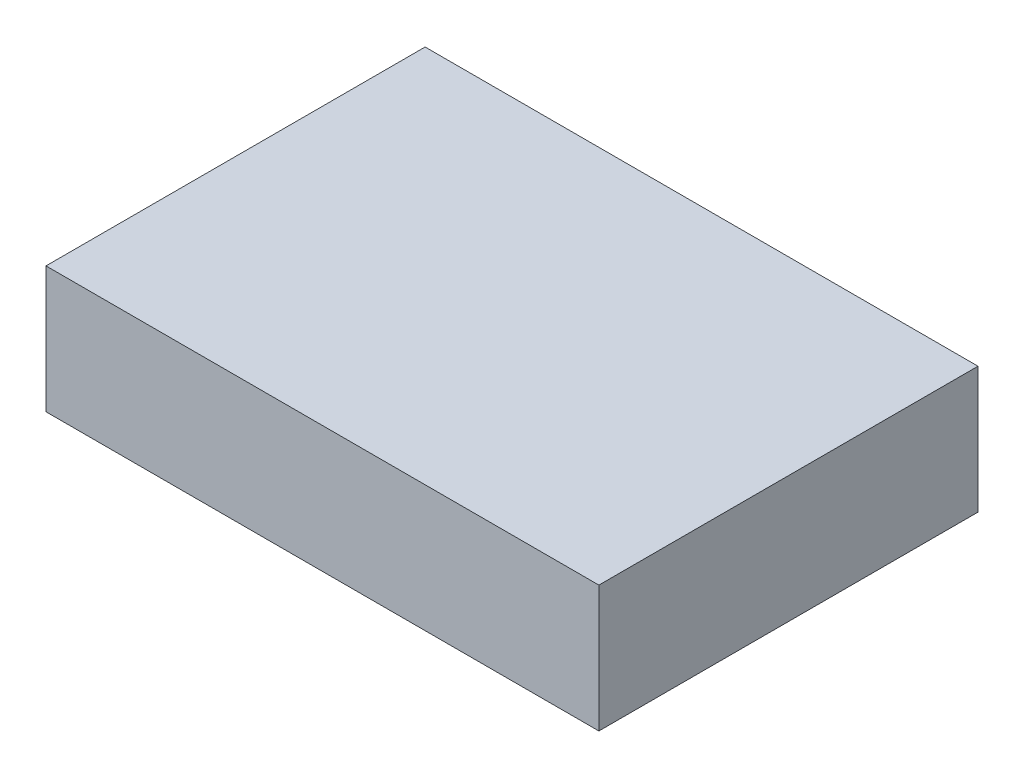
ISO-10303-21;
HEADER;
FILE_DESCRIPTION(('STEP AP214'),'2;1');
FILE_NAME('part.step','',(''),(''),'','','');
FILE_SCHEMA(('AUTOMOTIVE_DESIGN { 1 0 10303 214 1 1 1 1 }'));
ENDSEC;
DATA;
#1=APPLICATION_CONTEXT('core data for automotive mechanical design processes');
#2=APPLICATION_PROTOCOL_DEFINITION('international standard','automotive_design',2000,#1);
#3=PRODUCT_CONTEXT('',#1,'mechanical');
#4=PRODUCT('Part','Part','',(#3));
#5=PRODUCT_RELATED_PRODUCT_CATEGORY('part','',(#4));
#6=PRODUCT_DEFINITION_FORMATION('','',#4);
#7=PRODUCT_DEFINITION_CONTEXT('part definition',#1,'design');
#8=PRODUCT_DEFINITION('design','',#6,#7);
#9=PRODUCT_DEFINITION_SHAPE('','',#8);
#10=(LENGTH_UNIT() NAMED_UNIT(*) SI_UNIT(.MILLI.,.METRE.));
#11=(NAMED_UNIT(*) PLANE_ANGLE_UNIT() SI_UNIT($,.RADIAN.));
#12=(NAMED_UNIT(*) SI_UNIT($,.STERADIAN.) SOLID_ANGLE_UNIT());
#13=UNCERTAINTY_MEASURE_WITH_UNIT(LENGTH_MEASURE(1.E-05),#10,'distance_accuracy_value','');
#14=(GEOMETRIC_REPRESENTATION_CONTEXT(3) GLOBAL_UNCERTAINTY_ASSIGNED_CONTEXT((#13)) GLOBAL_UNIT_ASSIGNED_CONTEXT((#10,
#11,#12)) REPRESENTATION_CONTEXT('',''));
#15=CARTESIAN_POINT('',(0.,0.,0.));
#16=DIRECTION('',(0.,0.,1.));
#17=DIRECTION('',(1.,0.,0.));
#18=AXIS2_PLACEMENT_3D('',#15,#16,#17);
#19=CARTESIAN_POINT('',(17.5,8.,12.));
#20=DIRECTION('',(-1.,0.,0.));
#21=DIRECTION('',(0.,0.,1.));
#22=AXIS2_PLACEMENT_3D('',#19,#20,#21);
#23=PLANE('',#22);
#24=DIRECTION('',(0.,0.,-1.));
#25=VECTOR('',#24,1.);
#26=CARTESIAN_POINT('',(17.5,0.,12.));
#27=LINE('',#26,#25);
#28=CARTESIAN_POINT('',(17.5,0.,12.));
#29=VERTEX_POINT('',#28);
#30=CARTESIAN_POINT('',(17.5,0.,-12.));
#31=VERTEX_POINT('',#30);
#32=EDGE_CURVE('E98',#29,#31,#27,.T.);
#33=ORIENTED_EDGE('',*,*,#32,.T.);
#34=DIRECTION('',(0.,-1.,0.));
#35=VECTOR('',#34,1.);
#36=CARTESIAN_POINT('',(17.5,8.,-12.));
#37=LINE('',#36,#35);
#38=CARTESIAN_POINT('',(17.5,8.,-12.));
#39=VERTEX_POINT('',#38);
#40=EDGE_CURVE('E11',#39,#31,#37,.T.);
#41=ORIENTED_EDGE('',*,*,#40,.F.);
#42=DIRECTION('',(0.,0.,-1.));
#43=VECTOR('',#42,1.);
#44=CARTESIAN_POINT('',(17.5,8.,12.));
#45=LINE('',#44,#43);
#46=CARTESIAN_POINT('',(17.5,8.,12.));
#47=VERTEX_POINT('',#46);
#48=EDGE_CURVE('E86',#47,#39,#45,.T.);
#49=ORIENTED_EDGE('',*,*,#48,.F.);
#50=DIRECTION('',(0.,-1.,0.));
#51=VECTOR('',#50,1.);
#52=CARTESIAN_POINT('',(17.5,8.,12.));
#53=LINE('',#52,#51);
#54=EDGE_CURVE('E94',#47,#29,#53,.T.);
#55=ORIENTED_EDGE('',*,*,#54,.T.);
#56=EDGE_LOOP('',(#33,#41,#49,#55));
#57=FACE_BOUND('',#56,.T.);
#58=ADVANCED_FACE('F35',(#57),#23,.F.);
#59=CARTESIAN_POINT('',(-17.5,8.,-12.));
#60=DIRECTION('',(0.,0.,1.));
#61=DIRECTION('',(1.,0.,0.));
#62=AXIS2_PLACEMENT_3D('',#59,#60,#61);
#63=PLANE('',#62);
#64=DIRECTION('',(-1.,0.,0.));
#65=VECTOR('',#64,1.);
#66=CARTESIAN_POINT('',(-17.5,0.,-12.));
#67=LINE('',#66,#65);
#68=CARTESIAN_POINT('',(-17.5,0.,-12.));
#69=VERTEX_POINT('',#68);
#70=EDGE_CURVE('E90',#31,#69,#67,.T.);
#71=ORIENTED_EDGE('',*,*,#70,.T.);
#72=DIRECTION('',(0.,-1.,0.));
#73=VECTOR('',#72,1.);
#74=CARTESIAN_POINT('',(-17.5,8.,-12.));
#75=LINE('',#74,#73);
#76=CARTESIAN_POINT('',(-17.5,8.,-12.));
#77=VERTEX_POINT('',#76);
#78=EDGE_CURVE('E43',#77,#69,#75,.T.);
#79=ORIENTED_EDGE('',*,*,#78,.F.);
#80=DIRECTION('',(-1.,0.,0.));
#81=VECTOR('',#80,1.);
#82=CARTESIAN_POINT('',(-17.5,8.,-12.));
#83=LINE('',#82,#81);
#84=EDGE_CURVE('E81',#39,#77,#83,.T.);
#85=ORIENTED_EDGE('',*,*,#84,.F.);
#86=ORIENTED_EDGE('',*,*,#40,.T.);
#87=EDGE_LOOP('',(#71,#79,#85,#86));
#88=FACE_BOUND('',#87,.T.);
#89=ADVANCED_FACE('F89',(#88),#63,.F.);
#90=CARTESIAN_POINT('',(-17.5,8.,12.));
#91=DIRECTION('',(1.,0.,0.));
#92=DIRECTION('',(0.,0.,-1.));
#93=AXIS2_PLACEMENT_3D('',#90,#91,#92);
#94=PLANE('',#93);
#95=DIRECTION('',(0.,0.,1.));
#96=VECTOR('',#95,1.);
#97=CARTESIAN_POINT('',(-17.5,0.,12.));
#98=LINE('',#97,#96);
#99=CARTESIAN_POINT('',(-17.5,0.,12.));
#100=VERTEX_POINT('',#99);
#101=EDGE_CURVE('E68',#69,#100,#98,.T.);
#102=ORIENTED_EDGE('',*,*,#101,.T.);
#103=DIRECTION('',(0.,-1.,0.));
#104=VECTOR('',#103,1.);
#105=CARTESIAN_POINT('',(-17.5,8.,12.));
#106=LINE('',#105,#104);
#107=CARTESIAN_POINT('',(-17.5,8.,12.));
#108=VERTEX_POINT('',#107);
#109=EDGE_CURVE('E91',#108,#100,#106,.T.);
#110=ORIENTED_EDGE('',*,*,#109,.F.);
#111=DIRECTION('',(0.,0.,1.));
#112=VECTOR('',#111,1.);
#113=CARTESIAN_POINT('',(-17.5,8.,12.));
#114=LINE('',#113,#112);
#115=EDGE_CURVE('E84',#77,#108,#114,.T.);
#116=ORIENTED_EDGE('',*,*,#115,.F.);
#117=ORIENTED_EDGE('',*,*,#78,.T.);
#118=EDGE_LOOP('',(#102,#110,#116,#117));
#119=FACE_BOUND('',#118,.T.);
#120=ADVANCED_FACE('F92',(#119),#94,.F.);
#121=CARTESIAN_POINT('',(-17.5,8.,12.));
#122=DIRECTION('',(0.,0.,-1.));
#123=DIRECTION('',(-1.,0.,0.));
#124=AXIS2_PLACEMENT_3D('',#121,#122,#123);
#125=PLANE('',#124);
#126=DIRECTION('',(1.,0.,0.));
#127=VECTOR('',#126,1.);
#128=CARTESIAN_POINT('',(-17.5,0.,12.));
#129=LINE('',#128,#127);
#130=EDGE_CURVE('E74',#100,#29,#129,.T.);
#131=ORIENTED_EDGE('',*,*,#130,.T.);
#132=ORIENTED_EDGE('',*,*,#54,.F.);
#133=DIRECTION('',(1.,0.,0.));
#134=VECTOR('',#133,1.);
#135=CARTESIAN_POINT('',(-17.5,8.,12.));
#136=LINE('',#135,#134);
#137=EDGE_CURVE('E51',#108,#47,#136,.T.);
#138=ORIENTED_EDGE('',*,*,#137,.F.);
#139=ORIENTED_EDGE('',*,*,#109,.T.);
#140=EDGE_LOOP('',(#131,#132,#138,#139));
#141=FACE_BOUND('',#140,.T.);
#142=ADVANCED_FACE('F105',(#141),#125,.F.);
#143=CARTESIAN_POINT('',(0.,8.,0.));
#144=DIRECTION('',(0.,-1.,0.));
#145=DIRECTION('',(0.,0.,-1.));
#146=AXIS2_PLACEMENT_3D('',#143,#144,#145);
#147=PLANE('',#146);
#148=ORIENTED_EDGE('',*,*,#48,.T.);
#149=ORIENTED_EDGE('',*,*,#84,.T.);
#150=ORIENTED_EDGE('',*,*,#115,.T.);
#151=ORIENTED_EDGE('',*,*,#137,.T.);
#152=EDGE_LOOP('',(#148,#149,#150,#151));
#153=FACE_BOUND('',#152,.T.);
#154=ADVANCED_FACE('F82',(#153),#147,.F.);
#155=CARTESIAN_POINT('',(0.,0.,0.));
#156=DIRECTION('',(0.,-1.,0.));
#157=DIRECTION('',(0.,0.,-1.));
#158=AXIS2_PLACEMENT_3D('',#155,#156,#157);
#159=PLANE('',#158);
#160=ORIENTED_EDGE('',*,*,#32,.F.);
#161=ORIENTED_EDGE('',*,*,#130,.F.);
#162=ORIENTED_EDGE('',*,*,#101,.F.);
#163=ORIENTED_EDGE('',*,*,#70,.F.);
#164=EDGE_LOOP('',(#160,#161,#162,#163));
#165=FACE_BOUND('',#164,.T.);
#166=ADVANCED_FACE('F108',(#165),#159,.T.);
#167=CLOSED_SHELL('',(#58,#89,#120,#142,#154,#166));
#168=MANIFOLD_SOLID_BREP('B2',#167);
#169=ADVANCED_BREP_SHAPE_REPRESENTATION('',(#18,#168),#14);
#170=SHAPE_DEFINITION_REPRESENTATION(#9,#169);
ENDSEC;
END-ISO-10303-21;
